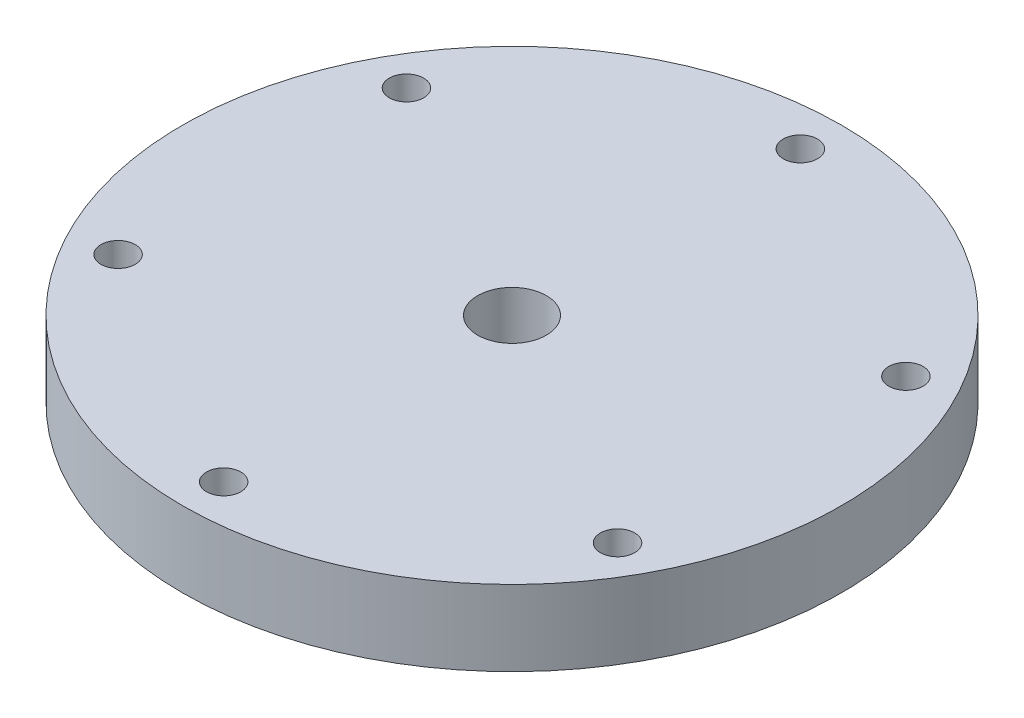
ISO-10303-21;
HEADER;
FILE_DESCRIPTION(('STEP AP214'),'2;1');
FILE_NAME('part.step','',(''),(''),'','','');
FILE_SCHEMA(('AUTOMOTIVE_DESIGN { 1 0 10303 214 1 1 1 1 }'));
ENDSEC;
DATA;
#1=APPLICATION_CONTEXT('core data for automotive mechanical design processes');
#2=APPLICATION_PROTOCOL_DEFINITION('international standard','automotive_design',2000,#1);
#3=PRODUCT_CONTEXT('',#1,'mechanical');
#4=PRODUCT('Part','Part','',(#3));
#5=PRODUCT_RELATED_PRODUCT_CATEGORY('part','',(#4));
#6=PRODUCT_DEFINITION_FORMATION('','',#4);
#7=PRODUCT_DEFINITION_CONTEXT('part definition',#1,'design');
#8=PRODUCT_DEFINITION('design','',#6,#7);
#9=PRODUCT_DEFINITION_SHAPE('','',#8);
#10=(LENGTH_UNIT() NAMED_UNIT(*) SI_UNIT(.MILLI.,.METRE.));
#11=(NAMED_UNIT(*) PLANE_ANGLE_UNIT() SI_UNIT($,.RADIAN.));
#12=(NAMED_UNIT(*) SI_UNIT($,.STERADIAN.) SOLID_ANGLE_UNIT());
#13=UNCERTAINTY_MEASURE_WITH_UNIT(LENGTH_MEASURE(1.E-05),#10,'distance_accuracy_value','');
#14=(GEOMETRIC_REPRESENTATION_CONTEXT(3) GLOBAL_UNCERTAINTY_ASSIGNED_CONTEXT((#13)) GLOBAL_UNIT_ASSIGNED_CONTEXT((#10,
#11,#12)) REPRESENTATION_CONTEXT('',''));
#15=CARTESIAN_POINT('',(0.,0.,0.));
#16=DIRECTION('',(0.,0.,1.));
#17=DIRECTION('',(1.,0.,0.));
#18=AXIS2_PLACEMENT_3D('',#15,#16,#17);
#19=CARTESIAN_POINT('',(0.,4.13066032039929,0.));
#20=DIRECTION('',(0.,-1.,0.));
#21=DIRECTION('',(0.,0.,-1.));
#22=AXIS2_PLACEMENT_3D('',#19,#20,#21);
#23=CYLINDRICAL_SURFACE('',#22,36.);
#24=CARTESIAN_POINT('',(0.,4.13066032039929,0.));
#25=DIRECTION('',(0.,1.,0.));
#26=DIRECTION('',(0.,0.,1.));
#27=AXIS2_PLACEMENT_3D('',#24,#25,#26);
#28=CIRCLE('',#27,36.);
#29=CARTESIAN_POINT('',(0.,4.13066032039929,36.));
#30=VERTEX_POINT('',#29);
#31=EDGE_CURVE('E11',#30,#30,#28,.T.);
#32=ORIENTED_EDGE('',*,*,#31,.F.);
#33=EDGE_LOOP('',(#32));
#34=FACE_BOUND('',#33,.T.);
#35=CARTESIAN_POINT('',(0.,-4.11933967960071,0.));
#36=DIRECTION('',(0.,1.,0.));
#37=DIRECTION('',(0.,0.,1.));
#38=AXIS2_PLACEMENT_3D('',#35,#36,#37);
#39=CIRCLE('',#38,36.);
#40=CARTESIAN_POINT('',(0.,-4.11933967960071,36.));
#41=VERTEX_POINT('',#40);
#42=EDGE_CURVE('E47',#41,#41,#39,.T.);
#43=ORIENTED_EDGE('',*,*,#42,.T.);
#44=EDGE_LOOP('',(#43));
#45=FACE_BOUND('',#44,.T.);
#46=ADVANCED_FACE('F40',(#34,#45),#23,.T.);
#47=CARTESIAN_POINT('',(0.,4.13066032039929,0.));
#48=DIRECTION('',(0.,1.,0.));
#49=DIRECTION('',(0.,0.,1.));
#50=AXIS2_PLACEMENT_3D('',#47,#48,#49);
#51=PLANE('',#50);
#52=CARTESIAN_POINT('',(27.2798002192096,4.13066032039929,-15.7500000000003));
#53=DIRECTION('',(0.,1.,0.));
#54=DIRECTION('',(-0.866025403784433,0.,0.50000000000001));
#55=AXIS2_PLACEMENT_3D('',#52,#53,#54);
#56=CIRCLE('',#55,1.875);
#57=CARTESIAN_POINT('',(25.6560025871138,4.13066032039929,-14.8125000000003));
#58=VERTEX_POINT('',#57);
#59=EDGE_CURVE('E69',#58,#58,#56,.T.);
#60=ORIENTED_EDGE('',*,*,#59,.F.);
#61=EDGE_LOOP('',(#60));
#62=FACE_BOUND('',#61,.T.);
#63=CARTESIAN_POINT('',(27.27980021921,4.13066032039929,15.7499999999997));
#64=DIRECTION('',(0.,1.,0.));
#65=DIRECTION('',(-0.866025403784443,0.,-0.499999999999992));
#66=AXIS2_PLACEMENT_3D('',#63,#64,#65);
#67=CIRCLE('',#66,1.875);
#68=CARTESIAN_POINT('',(25.6560025871141,4.13066032039929,14.8124999999998));
#69=VERTEX_POINT('',#68);
#70=EDGE_CURVE('E75',#69,#69,#67,.T.);
#71=ORIENTED_EDGE('',*,*,#70,.F.);
#72=EDGE_LOOP('',(#71));
#73=FACE_BOUND('',#72,.T.);
#74=CARTESIAN_POINT('',(0.,4.13066032039929,31.5));
#75=DIRECTION('',(0.,1.,0.));
#76=DIRECTION('',(0.,0.,-1.));
#77=AXIS2_PLACEMENT_3D('',#74,#75,#76);
#78=CIRCLE('',#77,1.875);
#79=CARTESIAN_POINT('',(0.,4.13066032039929,29.625));
#80=VERTEX_POINT('',#79);
#81=EDGE_CURVE('E81',#80,#80,#78,.T.);
#82=ORIENTED_EDGE('',*,*,#81,.F.);
#83=EDGE_LOOP('',(#82));
#84=FACE_BOUND('',#83,.T.);
#85=CARTESIAN_POINT('',(-27.2798002192098,4.13066032039929,15.7500000000001));
#86=DIRECTION('',(0.,1.,0.));
#87=DIRECTION('',(0.866025403784436,0.,-0.500000000000004));
#88=AXIS2_PLACEMENT_3D('',#85,#86,#87);
#89=CIRCLE('',#88,1.875);
#90=CARTESIAN_POINT('',(-25.6560025871139,4.13066032039929,14.8125000000001));
#91=VERTEX_POINT('',#90);
#92=EDGE_CURVE('E87',#91,#91,#89,.T.);
#93=ORIENTED_EDGE('',*,*,#92,.F.);
#94=EDGE_LOOP('',(#93));
#95=FACE_BOUND('',#94,.T.);
#96=CARTESIAN_POINT('',(-27.2798002192099,4.13066032039929,-15.7499999999999));
#97=DIRECTION('',(0.,1.,0.));
#98=DIRECTION('',(0.86602540378444,0.,0.499999999999998));
#99=AXIS2_PLACEMENT_3D('',#96,#97,#98);
#100=CIRCLE('',#99,1.875);
#101=CARTESIAN_POINT('',(-25.656002587114,4.13066032039929,-14.8124999999999));
#102=VERTEX_POINT('',#101);
#103=EDGE_CURVE('E63',#102,#102,#100,.T.);
#104=ORIENTED_EDGE('',*,*,#103,.F.);
#105=EDGE_LOOP('',(#104));
#106=FACE_BOUND('',#105,.T.);
#107=CARTESIAN_POINT('',(0.,4.13066032039929,-31.5));
#108=DIRECTION('',(0.,1.,0.));
#109=DIRECTION('',(0.,0.,1.));
#110=AXIS2_PLACEMENT_3D('',#107,#108,#109);
#111=CIRCLE('',#110,1.875);
#112=CARTESIAN_POINT('',(0.,4.13066032039929,-29.625));
#113=VERTEX_POINT('',#112);
#114=EDGE_CURVE('E57',#113,#113,#111,.T.);
#115=ORIENTED_EDGE('',*,*,#114,.F.);
#116=EDGE_LOOP('',(#115));
#117=FACE_BOUND('',#116,.T.);
#118=CARTESIAN_POINT('',(0.,4.13066032039929,0.));
#119=DIRECTION('',(0.,1.,0.));
#120=DIRECTION('',(0.,0.,1.));
#121=AXIS2_PLACEMENT_3D('',#118,#119,#120);
#122=CIRCLE('',#121,3.75);
#123=CARTESIAN_POINT('',(0.,4.13066032039929,3.75));
#124=VERTEX_POINT('',#123);
#125=EDGE_CURVE('E53',#124,#124,#122,.T.);
#126=ORIENTED_EDGE('',*,*,#125,.F.);
#127=EDGE_LOOP('',(#126));
#128=FACE_BOUND('',#127,.T.);
#129=ORIENTED_EDGE('',*,*,#31,.T.);
#130=EDGE_LOOP('',(#129));
#131=FACE_BOUND('',#130,.T.);
#132=ADVANCED_FACE('F102',(#62,#73,#84,#95,#106,#117,#128,#131),#51,.T.);
#133=CARTESIAN_POINT('',(0.,-4.11933967960071,0.));
#134=DIRECTION('',(0.,1.,0.));
#135=DIRECTION('',(0.,0.,1.));
#136=AXIS2_PLACEMENT_3D('',#133,#134,#135);
#137=PLANE('',#136);
#138=CARTESIAN_POINT('',(0.,-4.11933967960071,0.));
#139=DIRECTION('',(0.,1.,0.));
#140=DIRECTION('',(0.,0.,1.));
#141=AXIS2_PLACEMENT_3D('',#138,#139,#140);
#142=CIRCLE('',#141,3.75);
#143=CARTESIAN_POINT('',(0.,-4.11933967960071,3.75));
#144=VERTEX_POINT('',#143);
#145=EDGE_CURVE('E43',#144,#144,#142,.T.);
#146=ORIENTED_EDGE('',*,*,#145,.T.);
#147=EDGE_LOOP('',(#146));
#148=FACE_BOUND('',#147,.T.);
#149=ORIENTED_EDGE('',*,*,#42,.F.);
#150=EDGE_LOOP('',(#149));
#151=FACE_BOUND('',#150,.T.);
#152=ADVANCED_FACE('F105',(#148,#151),#137,.F.);
#153=CARTESIAN_POINT('',(0.,-28.8693396796007,0.));
#154=DIRECTION('',(0.,1.,0.));
#155=DIRECTION('',(0.,0.,1.));
#156=AXIS2_PLACEMENT_3D('',#153,#154,#155);
#157=CYLINDRICAL_SURFACE('',#156,3.75);
#158=ORIENTED_EDGE('',*,*,#125,.T.);
#159=EDGE_LOOP('',(#158));
#160=FACE_BOUND('',#159,.T.);
#161=ORIENTED_EDGE('',*,*,#145,.F.);
#162=EDGE_LOOP('',(#161));
#163=FACE_BOUND('',#162,.T.);
#164=ADVANCED_FACE('F114',(#160,#163),#157,.F.);
#165=CARTESIAN_POINT('',(0.,-0.369339679600709,-31.5));
#166=DIRECTION('',(0.,1.,0.));
#167=DIRECTION('',(0.,0.,1.));
#168=AXIS2_PLACEMENT_3D('',#165,#166,#167);
#169=CYLINDRICAL_SURFACE('',#168,1.875);
#170=CARTESIAN_POINT('',(0.,-0.369339679600709,-31.5));
#171=DIRECTION('',(0.,1.,0.));
#172=DIRECTION('',(0.,0.,1.));
#173=AXIS2_PLACEMENT_3D('',#170,#171,#172);
#174=CIRCLE('',#173,1.875);
#175=CARTESIAN_POINT('',(0.,-0.369339679600709,-29.625));
#176=VERTEX_POINT('',#175);
#177=EDGE_CURVE('E56',#176,#176,#174,.T.);
#178=ORIENTED_EDGE('',*,*,#177,.F.);
#179=EDGE_LOOP('',(#178));
#180=FACE_BOUND('',#179,.T.);
#181=ORIENTED_EDGE('',*,*,#114,.T.);
#182=EDGE_LOOP('',(#181));
#183=FACE_BOUND('',#182,.T.);
#184=ADVANCED_FACE('F117',(#180,#183),#169,.F.);
#185=CARTESIAN_POINT('',(0.,-0.369339679600709,-31.5));
#186=DIRECTION('',(0.,1.,0.));
#187=DIRECTION('',(0.,0.,1.));
#188=AXIS2_PLACEMENT_3D('',#185,#186,#187);
#189=PLANE('',#188);
#190=ORIENTED_EDGE('',*,*,#177,.T.);
#191=EDGE_LOOP('',(#190));
#192=FACE_BOUND('',#191,.T.);
#193=ADVANCED_FACE('F152',(#192),#189,.T.);
#194=CARTESIAN_POINT('',(-27.2798002192099,-0.369339679600709,-15.7499999999999));
#195=DIRECTION('',(0.,1.,0.));
#196=DIRECTION('',(0.,0.,1.));
#197=AXIS2_PLACEMENT_3D('',#194,#195,#196);
#198=CYLINDRICAL_SURFACE('',#197,1.875);
#199=CARTESIAN_POINT('',(-27.2798002192099,-0.369339679600709,-15.7499999999999));
#200=DIRECTION('',(0.,1.,0.));
#201=DIRECTION('',(0.86602540378444,0.,0.499999999999998));
#202=AXIS2_PLACEMENT_3D('',#199,#200,#201);
#203=CIRCLE('',#202,1.875);
#204=CARTESIAN_POINT('',(-25.656002587114,-0.369339679600709,-14.8124999999999));
#205=VERTEX_POINT('',#204);
#206=EDGE_CURVE('E60',#205,#205,#203,.T.);
#207=ORIENTED_EDGE('',*,*,#206,.F.);
#208=EDGE_LOOP('',(#207));
#209=FACE_BOUND('',#208,.T.);
#210=ORIENTED_EDGE('',*,*,#103,.T.);
#211=EDGE_LOOP('',(#210));
#212=FACE_BOUND('',#211,.T.);
#213=ADVANCED_FACE('F161',(#209,#212),#198,.F.);
#214=CARTESIAN_POINT('',(-27.2798002192099,-0.369339679600709,-15.7499999999999));
#215=DIRECTION('',(0.,1.,0.));
#216=DIRECTION('',(0.86602540378444,0.,0.499999999999998));
#217=AXIS2_PLACEMENT_3D('',#214,#215,#216);
#218=PLANE('',#217);
#219=ORIENTED_EDGE('',*,*,#206,.T.);
#220=EDGE_LOOP('',(#219));
#221=FACE_BOUND('',#220,.T.);
#222=ADVANCED_FACE('F98',(#221),#218,.T.);
#223=CARTESIAN_POINT('',(-27.2798002192098,-0.369339679600709,15.7500000000001));
#224=DIRECTION('',(0.,1.,0.));
#225=DIRECTION('',(0.,0.,1.));
#226=AXIS2_PLACEMENT_3D('',#223,#224,#225);
#227=CYLINDRICAL_SURFACE('',#226,1.875);
#228=CARTESIAN_POINT('',(-27.2798002192098,-0.369339679600709,15.7500000000001));
#229=DIRECTION('',(0.,1.,0.));
#230=DIRECTION('',(0.866025403784436,0.,-0.500000000000004));
#231=AXIS2_PLACEMENT_3D('',#228,#229,#230);
#232=CIRCLE('',#231,1.875);
#233=CARTESIAN_POINT('',(-25.6560025871139,-0.369339679600709,14.8125000000001));
#234=VERTEX_POINT('',#233);
#235=EDGE_CURVE('E66',#234,#234,#232,.T.);
#236=ORIENTED_EDGE('',*,*,#235,.F.);
#237=EDGE_LOOP('',(#236));
#238=FACE_BOUND('',#237,.T.);
#239=ORIENTED_EDGE('',*,*,#92,.T.);
#240=EDGE_LOOP('',(#239));
#241=FACE_BOUND('',#240,.T.);
#242=ADVANCED_FACE('F95',(#238,#241),#227,.F.);
#243=CARTESIAN_POINT('',(-27.2798002192098,-0.369339679600709,15.7500000000001));
#244=DIRECTION('',(0.,1.,0.));
#245=DIRECTION('',(0.866025403784436,0.,-0.500000000000004));
#246=AXIS2_PLACEMENT_3D('',#243,#244,#245);
#247=PLANE('',#246);
#248=ORIENTED_EDGE('',*,*,#235,.T.);
#249=EDGE_LOOP('',(#248));
#250=FACE_BOUND('',#249,.T.);
#251=ADVANCED_FACE('F93',(#250),#247,.T.);
#252=CARTESIAN_POINT('',(0.,-0.369339679600709,31.5));
#253=DIRECTION('',(0.,1.,0.));
#254=DIRECTION('',(0.,0.,1.));
#255=AXIS2_PLACEMENT_3D('',#252,#253,#254);
#256=CYLINDRICAL_SURFACE('',#255,1.875);
#257=CARTESIAN_POINT('',(0.,-0.369339679600709,31.5));
#258=DIRECTION('',(0.,1.,0.));
#259=DIRECTION('',(0.,0.,-1.));
#260=AXIS2_PLACEMENT_3D('',#257,#258,#259);
#261=CIRCLE('',#260,1.875);
#262=CARTESIAN_POINT('',(0.,-0.369339679600709,29.625));
#263=VERTEX_POINT('',#262);
#264=EDGE_CURVE('E84',#263,#263,#261,.T.);
#265=ORIENTED_EDGE('',*,*,#264,.F.);
#266=EDGE_LOOP('',(#265));
#267=FACE_BOUND('',#266,.T.);
#268=ORIENTED_EDGE('',*,*,#81,.T.);
#269=EDGE_LOOP('',(#268));
#270=FACE_BOUND('',#269,.T.);
#271=ADVANCED_FACE('F191',(#267,#270),#256,.F.);
#272=CARTESIAN_POINT('',(0.,-0.369339679600709,31.5));
#273=DIRECTION('',(0.,1.,0.));
#274=DIRECTION('',(0.,0.,-1.));
#275=AXIS2_PLACEMENT_3D('',#272,#273,#274);
#276=PLANE('',#275);
#277=ORIENTED_EDGE('',*,*,#264,.T.);
#278=EDGE_LOOP('',(#277));
#279=FACE_BOUND('',#278,.T.);
#280=ADVANCED_FACE('F199',(#279),#276,.T.);
#281=CARTESIAN_POINT('',(27.27980021921,-0.369339679600709,15.7499999999997));
#282=DIRECTION('',(0.,1.,0.));
#283=DIRECTION('',(0.,0.,1.));
#284=AXIS2_PLACEMENT_3D('',#281,#282,#283);
#285=CYLINDRICAL_SURFACE('',#284,1.875);
#286=CARTESIAN_POINT('',(27.27980021921,-0.369339679600709,15.7499999999997));
#287=DIRECTION('',(0.,1.,0.));
#288=DIRECTION('',(-0.866025403784443,0.,-0.499999999999992));
#289=AXIS2_PLACEMENT_3D('',#286,#287,#288);
#290=CIRCLE('',#289,1.875);
#291=CARTESIAN_POINT('',(25.6560025871141,-0.369339679600709,14.8124999999998));
#292=VERTEX_POINT('',#291);
#293=EDGE_CURVE('E78',#292,#292,#290,.T.);
#294=ORIENTED_EDGE('',*,*,#293,.F.);
#295=EDGE_LOOP('',(#294));
#296=FACE_BOUND('',#295,.T.);
#297=ORIENTED_EDGE('',*,*,#70,.T.);
#298=EDGE_LOOP('',(#297));
#299=FACE_BOUND('',#298,.T.);
#300=ADVANCED_FACE('F208',(#296,#299),#285,.F.);
#301=CARTESIAN_POINT('',(27.27980021921,-0.369339679600709,15.7499999999997));
#302=DIRECTION('',(0.,1.,0.));
#303=DIRECTION('',(-0.866025403784443,0.,-0.499999999999992));
#304=AXIS2_PLACEMENT_3D('',#301,#302,#303);
#305=PLANE('',#304);
#306=ORIENTED_EDGE('',*,*,#293,.T.);
#307=EDGE_LOOP('',(#306));
#308=FACE_BOUND('',#307,.T.);
#309=ADVANCED_FACE('F217',(#308),#305,.T.);
#310=CARTESIAN_POINT('',(27.2798002192096,-0.369339679600709,-15.7500000000003));
#311=DIRECTION('',(0.,1.,0.));
#312=DIRECTION('',(0.,0.,1.));
#313=AXIS2_PLACEMENT_3D('',#310,#311,#312);
#314=CYLINDRICAL_SURFACE('',#313,1.875);
#315=CARTESIAN_POINT('',(27.2798002192096,-0.369339679600709,-15.7500000000003));
#316=DIRECTION('',(0.,1.,0.));
#317=DIRECTION('',(-0.866025403784433,0.,0.50000000000001));
#318=AXIS2_PLACEMENT_3D('',#315,#316,#317);
#319=CIRCLE('',#318,1.875);
#320=CARTESIAN_POINT('',(25.6560025871138,-0.369339679600709,-14.8125000000003));
#321=VERTEX_POINT('',#320);
#322=EDGE_CURVE('E72',#321,#321,#319,.T.);
#323=ORIENTED_EDGE('',*,*,#322,.F.);
#324=EDGE_LOOP('',(#323));
#325=FACE_BOUND('',#324,.T.);
#326=ORIENTED_EDGE('',*,*,#59,.T.);
#327=EDGE_LOOP('',(#326));
#328=FACE_BOUND('',#327,.T.);
#329=ADVANCED_FACE('F226',(#325,#328),#314,.F.);
#330=CARTESIAN_POINT('',(27.2798002192096,-0.369339679600709,-15.7500000000003));
#331=DIRECTION('',(0.,1.,0.));
#332=DIRECTION('',(-0.866025403784433,0.,0.50000000000001));
#333=AXIS2_PLACEMENT_3D('',#330,#331,#332);
#334=PLANE('',#333);
#335=ORIENTED_EDGE('',*,*,#322,.T.);
#336=EDGE_LOOP('',(#335));
#337=FACE_BOUND('',#336,.T.);
#338=ADVANCED_FACE('F235',(#337),#334,.T.);
#339=CLOSED_SHELL('',(#46,#132,#152,#164,#184,#193,#213,#222,#242,#251,#271,#280,#300,#309,#329,#338));
#340=MANIFOLD_SOLID_BREP('B2',#339);
#341=ADVANCED_BREP_SHAPE_REPRESENTATION('',(#18,#340),#14);
#342=SHAPE_DEFINITION_REPRESENTATION(#9,#341);
ENDSEC;
END-ISO-10303-21;
